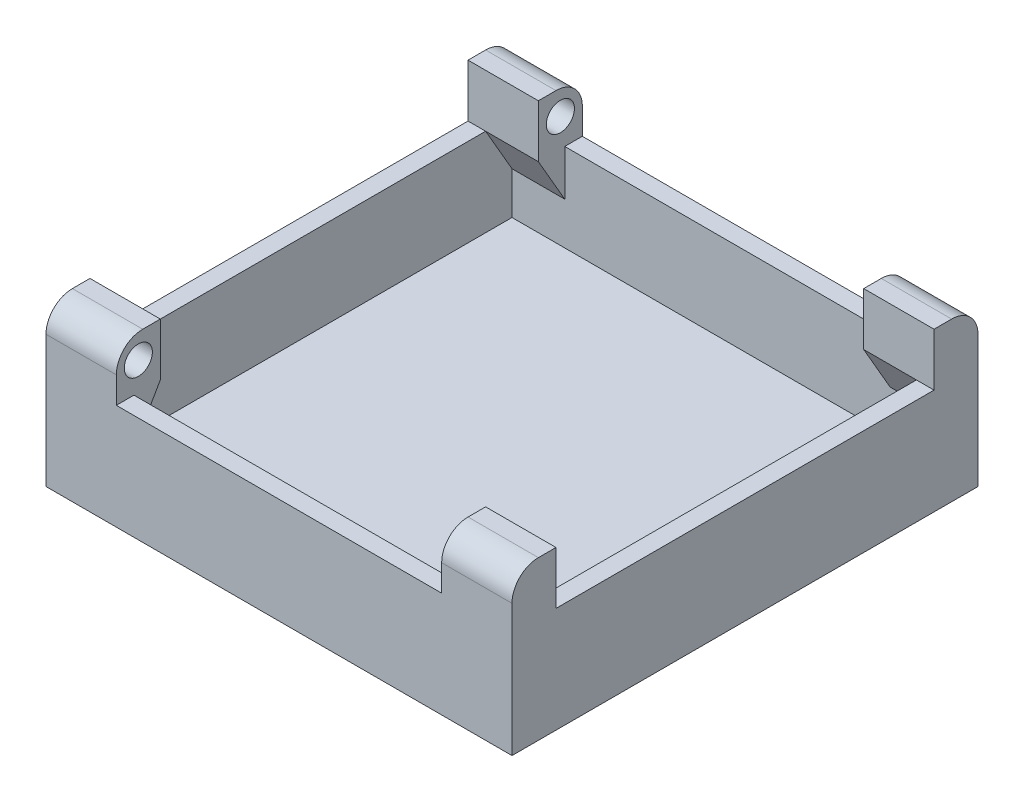
ISO-10303-21;
HEADER;
FILE_DESCRIPTION(('STEP AP214'),'2;1');
FILE_NAME('part.step','',(''),(''),'','','');
FILE_SCHEMA(('AUTOMOTIVE_DESIGN { 1 0 10303 214 1 1 1 1 }'));
ENDSEC;
DATA;
#1=APPLICATION_CONTEXT('core data for automotive mechanical design processes');
#2=APPLICATION_PROTOCOL_DEFINITION('international standard','automotive_design',2000,#1);
#3=PRODUCT_CONTEXT('',#1,'mechanical');
#4=PRODUCT('Part','Part','',(#3));
#5=PRODUCT_RELATED_PRODUCT_CATEGORY('part','',(#4));
#6=PRODUCT_DEFINITION_FORMATION('','',#4);
#7=PRODUCT_DEFINITION_CONTEXT('part definition',#1,'design');
#8=PRODUCT_DEFINITION('design','',#6,#7);
#9=PRODUCT_DEFINITION_SHAPE('','',#8);
#10=(LENGTH_UNIT() NAMED_UNIT(*) SI_UNIT(.MILLI.,.METRE.));
#11=(NAMED_UNIT(*) PLANE_ANGLE_UNIT() SI_UNIT($,.RADIAN.));
#12=(NAMED_UNIT(*) SI_UNIT($,.STERADIAN.) SOLID_ANGLE_UNIT());
#13=UNCERTAINTY_MEASURE_WITH_UNIT(LENGTH_MEASURE(1.E-05),#10,'distance_accuracy_value','');
#14=(GEOMETRIC_REPRESENTATION_CONTEXT(3) GLOBAL_UNCERTAINTY_ASSIGNED_CONTEXT((#13)) GLOBAL_UNIT_ASSIGNED_CONTEXT((#10,
#11,#12)) REPRESENTATION_CONTEXT('',''));
#15=CARTESIAN_POINT('',(0.,0.,0.));
#16=DIRECTION('',(0.,0.,1.));
#17=DIRECTION('',(1.,0.,0.));
#18=AXIS2_PLACEMENT_3D('',#15,#16,#17);
#19=CARTESIAN_POINT('',(0.,10.,0.));
#20=DIRECTION('',(0.,-1.,0.));
#21=DIRECTION('',(0.,0.,-1.));
#22=AXIS2_PLACEMENT_3D('',#19,#20,#21);
#23=PLANE('',#22);
#24=DIRECTION('',(1.,0.,0.));
#25=VECTOR('',#24,1.);
#26=CARTESIAN_POINT('',(-26.5,10.,-21.5));
#27=LINE('',#26,#25);
#28=CARTESIAN_POINT('',(-26.5,10.,-21.5));
#29=VERTEX_POINT('',#28);
#30=CARTESIAN_POINT('',(-24.5,10.,-21.5));
#31=VERTEX_POINT('',#30);
#32=EDGE_CURVE('E567',#29,#31,#27,.T.);
#33=ORIENTED_EDGE('',*,*,#32,.F.);
#34=DIRECTION('',(0.,0.,1.));
#35=VECTOR('',#34,1.);
#36=CARTESIAN_POINT('',(-26.5,10.,26.5));
#37=LINE('',#36,#35);
#38=CARTESIAN_POINT('',(-26.5,10.,21.5));
#39=VERTEX_POINT('',#38);
#40=EDGE_CURVE('E261',#29,#39,#37,.T.);
#41=ORIENTED_EDGE('',*,*,#40,.T.);
#42=DIRECTION('',(-1.,0.,0.));
#43=VECTOR('',#42,1.);
#44=CARTESIAN_POINT('',(-26.5,10.,21.5));
#45=LINE('',#44,#43);
#46=CARTESIAN_POINT('',(-24.5,10.,21.5));
#47=VERTEX_POINT('',#46);
#48=EDGE_CURVE('E323',#47,#39,#45,.T.);
#49=ORIENTED_EDGE('',*,*,#48,.F.);
#50=DIRECTION('',(0.,0.,1.));
#51=VECTOR('',#50,1.);
#52=CARTESIAN_POINT('',(-24.5,10.,24.5));
#53=LINE('',#52,#51);
#54=EDGE_CURVE('E343',#31,#47,#53,.T.);
#55=ORIENTED_EDGE('',*,*,#54,.F.);
#56=EDGE_LOOP('',(#33,#41,#49,#55));
#57=FACE_BOUND('',#56,.T.);
#58=ADVANCED_FACE('F40',(#57),#23,.F.);
#59=DIRECTION('',(0.,0.,-1.));
#60=VECTOR('',#59,1.);
#61=CARTESIAN_POINT('',(-18.5,10.,-26.5));
#62=LINE('',#61,#60);
#63=CARTESIAN_POINT('',(-18.5,10.,-24.5));
#64=VERTEX_POINT('',#63);
#65=CARTESIAN_POINT('',(-18.5,10.,-26.5));
#66=VERTEX_POINT('',#65);
#67=EDGE_CURVE('E245',#64,#66,#62,.T.);
#68=ORIENTED_EDGE('',*,*,#67,.F.);
#69=DIRECTION('',(-1.,0.,0.));
#70=VECTOR('',#69,1.);
#71=CARTESIAN_POINT('',(-24.5,10.,-24.5));
#72=LINE('',#71,#70);
#73=CARTESIAN_POINT('',(18.5,10.,-24.5));
#74=VERTEX_POINT('',#73);
#75=EDGE_CURVE('E352',#74,#64,#72,.T.);
#76=ORIENTED_EDGE('',*,*,#75,.F.);
#77=DIRECTION('',(0.,0.,1.));
#78=VECTOR('',#77,1.);
#79=CARTESIAN_POINT('',(18.5,10.,-26.5));
#80=LINE('',#79,#78);
#81=CARTESIAN_POINT('',(18.5,10.,-26.5));
#82=VERTEX_POINT('',#81);
#83=EDGE_CURVE('E262',#82,#74,#80,.T.);
#84=ORIENTED_EDGE('',*,*,#83,.F.);
#85=DIRECTION('',(-1.,0.,0.));
#86=VECTOR('',#85,1.);
#87=CARTESIAN_POINT('',(-26.5,10.,-26.5));
#88=LINE('',#87,#86);
#89=EDGE_CURVE('E376',#82,#66,#88,.T.);
#90=ORIENTED_EDGE('',*,*,#89,.T.);
#91=EDGE_LOOP('',(#68,#76,#84,#90));
#92=FACE_BOUND('',#91,.T.);
#93=ADVANCED_FACE('F494',(#92),#23,.F.);
#94=DIRECTION('',(1.,0.,0.));
#95=VECTOR('',#94,1.);
#96=CARTESIAN_POINT('',(26.5,10.,-21.5));
#97=LINE('',#96,#95);
#98=CARTESIAN_POINT('',(24.5,10.,-21.5));
#99=VERTEX_POINT('',#98);
#100=CARTESIAN_POINT('',(26.5,10.,-21.5));
#101=VERTEX_POINT('',#100);
#102=EDGE_CURVE('E265',#99,#101,#97,.T.);
#103=ORIENTED_EDGE('',*,*,#102,.F.);
#104=DIRECTION('',(0.,0.,-1.));
#105=VECTOR('',#104,1.);
#106=CARTESIAN_POINT('',(24.5,10.,24.5));
#107=LINE('',#106,#105);
#108=CARTESIAN_POINT('',(24.5,10.,21.5));
#109=VERTEX_POINT('',#108);
#110=EDGE_CURVE('E349',#109,#99,#107,.T.);
#111=ORIENTED_EDGE('',*,*,#110,.F.);
#112=DIRECTION('',(-1.,0.,0.));
#113=VECTOR('',#112,1.);
#114=CARTESIAN_POINT('',(26.5,10.,21.5));
#115=LINE('',#114,#113);
#116=CARTESIAN_POINT('',(26.5,10.,21.5));
#117=VERTEX_POINT('',#116);
#118=EDGE_CURVE('E298',#117,#109,#115,.T.);
#119=ORIENTED_EDGE('',*,*,#118,.F.);
#120=DIRECTION('',(0.,0.,-1.));
#121=VECTOR('',#120,1.);
#122=CARTESIAN_POINT('',(26.5,10.,26.5));
#123=LINE('',#122,#121);
#124=EDGE_CURVE('E373',#117,#101,#123,.T.);
#125=ORIENTED_EDGE('',*,*,#124,.T.);
#126=EDGE_LOOP('',(#103,#111,#119,#125));
#127=FACE_BOUND('',#126,.T.);
#128=ADVANCED_FACE('F507',(#127),#23,.F.);
#129=DIRECTION('',(0.,0.,1.));
#130=VECTOR('',#129,1.);
#131=CARTESIAN_POINT('',(18.5,10.,26.5));
#132=LINE('',#131,#130);
#133=CARTESIAN_POINT('',(18.5,10.,24.5));
#134=VERTEX_POINT('',#133);
#135=CARTESIAN_POINT('',(18.5,10.,26.5));
#136=VERTEX_POINT('',#135);
#137=EDGE_CURVE('E292',#134,#136,#132,.T.);
#138=ORIENTED_EDGE('',*,*,#137,.F.);
#139=DIRECTION('',(1.,0.,0.));
#140=VECTOR('',#139,1.);
#141=CARTESIAN_POINT('',(-24.5,10.,24.5));
#142=LINE('',#141,#140);
#143=CARTESIAN_POINT('',(-18.5,10.,24.5));
#144=VERTEX_POINT('',#143);
#145=EDGE_CURVE('E345',#144,#134,#142,.T.);
#146=ORIENTED_EDGE('',*,*,#145,.F.);
#147=DIRECTION('',(0.,0.,-1.));
#148=VECTOR('',#147,1.);
#149=CARTESIAN_POINT('',(-18.5,10.,26.5));
#150=LINE('',#149,#148);
#151=CARTESIAN_POINT('',(-18.5,10.,26.5));
#152=VERTEX_POINT('',#151);
#153=EDGE_CURVE('E309',#152,#144,#150,.T.);
#154=ORIENTED_EDGE('',*,*,#153,.F.);
#155=DIRECTION('',(1.,0.,0.));
#156=VECTOR('',#155,1.);
#157=CARTESIAN_POINT('',(-26.5,10.,26.5));
#158=LINE('',#157,#156);
#159=EDGE_CURVE('E380',#152,#136,#158,.T.);
#160=ORIENTED_EDGE('',*,*,#159,.T.);
#161=EDGE_LOOP('',(#138,#146,#154,#160));
#162=FACE_BOUND('',#161,.T.);
#163=ADVANCED_FACE('F542',(#162),#23,.F.);
#164=CARTESIAN_POINT('',(26.5,10.,26.5));
#165=DIRECTION('',(-1.,0.,0.));
#166=DIRECTION('',(0.,0.,1.));
#167=AXIS2_PLACEMENT_3D('',#164,#165,#166);
#168=PLANE('',#167);
#169=DIRECTION('',(0.,0.,-1.));
#170=VECTOR('',#169,1.);
#171=CARTESIAN_POINT('',(26.5,16.,26.5));
#172=LINE('',#171,#170);
#173=CARTESIAN_POINT('',(26.5,16.,23.5));
#174=VERTEX_POINT('',#173);
#175=CARTESIAN_POINT('',(26.5,16.,21.5));
#176=VERTEX_POINT('',#175);
#177=EDGE_CURVE('E289',#174,#176,#172,.T.);
#178=ORIENTED_EDGE('',*,*,#177,.F.);
#179=CARTESIAN_POINT('',(26.5,13.,23.5));
#180=DIRECTION('',(-1.,0.,0.));
#181=DIRECTION('',(0.,0.,1.));
#182=AXIS2_PLACEMENT_3D('',#179,#180,#181);
#183=CIRCLE('',#182,3.);
#184=CARTESIAN_POINT('',(26.5,13.,26.5));
#185=VERTEX_POINT('',#184);
#186=EDGE_CURVE('E443',#174,#185,#183,.F.);
#187=ORIENTED_EDGE('',*,*,#186,.T.);
#188=DIRECTION('',(0.,-1.,0.));
#189=VECTOR('',#188,1.);
#190=CARTESIAN_POINT('',(26.5,10.,26.5));
#191=LINE('',#190,#189);
#192=CARTESIAN_POINT('',(26.5,-2.,26.5));
#193=VERTEX_POINT('',#192);
#194=EDGE_CURVE('E383',#185,#193,#191,.T.);
#195=ORIENTED_EDGE('',*,*,#194,.T.);
#196=DIRECTION('',(0.,0.,1.));
#197=VECTOR('',#196,1.);
#198=CARTESIAN_POINT('',(26.5,-2.,-26.5));
#199=LINE('',#198,#197);
#200=CARTESIAN_POINT('',(26.5,-2.,-26.5));
#201=VERTEX_POINT('',#200);
#202=EDGE_CURVE('E336',#201,#193,#199,.T.);
#203=ORIENTED_EDGE('',*,*,#202,.F.);
#204=DIRECTION('',(0.,-1.,0.));
#205=VECTOR('',#204,1.);
#206=CARTESIAN_POINT('',(26.5,10.,-26.5));
#207=LINE('',#206,#205);
#208=CARTESIAN_POINT('',(26.5,13.,-26.5));
#209=VERTEX_POINT('',#208);
#210=EDGE_CURVE('E389',#209,#201,#207,.T.);
#211=ORIENTED_EDGE('',*,*,#210,.F.);
#212=CARTESIAN_POINT('',(26.5,13.,-23.5));
#213=DIRECTION('',(-1.,0.,0.));
#214=DIRECTION('',(0.,0.,1.));
#215=AXIS2_PLACEMENT_3D('',#212,#213,#214);
#216=CIRCLE('',#215,3.);
#217=CARTESIAN_POINT('',(26.5,16.,-23.5));
#218=VERTEX_POINT('',#217);
#219=EDGE_CURVE('E441',#209,#218,#216,.F.);
#220=ORIENTED_EDGE('',*,*,#219,.T.);
#221=DIRECTION('',(0.,0.,-1.));
#222=VECTOR('',#221,1.);
#223=CARTESIAN_POINT('',(26.5,16.,-26.5));
#224=LINE('',#223,#222);
#225=CARTESIAN_POINT('',(26.5,16.,-21.5));
#226=VERTEX_POINT('',#225);
#227=EDGE_CURVE('E276',#226,#218,#224,.T.);
#228=ORIENTED_EDGE('',*,*,#227,.F.);
#229=DIRECTION('',(0.,-1.,0.));
#230=VECTOR('',#229,1.);
#231=CARTESIAN_POINT('',(26.5,16.,-21.5));
#232=LINE('',#231,#230);
#233=EDGE_CURVE('E278',#226,#101,#232,.T.);
#234=ORIENTED_EDGE('',*,*,#233,.T.);
#235=ORIENTED_EDGE('',*,*,#124,.F.);
#236=DIRECTION('',(0.,-1.,0.));
#237=VECTOR('',#236,1.);
#238=CARTESIAN_POINT('',(26.5,16.,21.5));
#239=LINE('',#238,#237);
#240=EDGE_CURVE('E307',#176,#117,#239,.T.);
#241=ORIENTED_EDGE('',*,*,#240,.F.);
#242=EDGE_LOOP('',(#178,#187,#195,#203,#211,#220,#228,#234,#235,#241));
#243=FACE_BOUND('',#242,.T.);
#244=ADVANCED_FACE('F482',(#243),#168,.F.);
#245=CARTESIAN_POINT('',(-26.5,10.,-26.5));
#246=DIRECTION('',(0.,0.,1.));
#247=DIRECTION('',(1.,0.,0.));
#248=AXIS2_PLACEMENT_3D('',#245,#246,#247);
#249=PLANE('',#248);
#250=DIRECTION('',(0.,-1.,0.));
#251=VECTOR('',#250,1.);
#252=CARTESIAN_POINT('',(-26.5,10.,-26.5));
#253=LINE('',#252,#251);
#254=CARTESIAN_POINT('',(-26.5,13.,-26.5));
#255=VERTEX_POINT('',#254);
#256=CARTESIAN_POINT('',(-26.5,-2.,-26.5));
#257=VERTEX_POINT('',#256);
#258=EDGE_CURVE('E387',#255,#257,#253,.T.);
#259=ORIENTED_EDGE('',*,*,#258,.F.);
#260=DIRECTION('',(-1.,0.,0.));
#261=VECTOR('',#260,1.);
#262=CARTESIAN_POINT('',(-18.5,13.,-26.5));
#263=LINE('',#262,#261);
#264=CARTESIAN_POINT('',(-18.5,13.,-26.5));
#265=VERTEX_POINT('',#264);
#266=EDGE_CURVE('E463',#255,#265,#263,.F.);
#267=ORIENTED_EDGE('',*,*,#266,.T.);
#268=DIRECTION('',(0.,-1.,0.));
#269=VECTOR('',#268,1.);
#270=CARTESIAN_POINT('',(-18.5,16.,-26.5));
#271=LINE('',#270,#269);
#272=EDGE_CURVE('E267',#265,#66,#271,.T.);
#273=ORIENTED_EDGE('',*,*,#272,.T.);
#274=ORIENTED_EDGE('',*,*,#89,.F.);
#275=DIRECTION('',(0.,-1.,0.));
#276=VECTOR('',#275,1.);
#277=CARTESIAN_POINT('',(18.5,16.,-26.5));
#278=LINE('',#277,#276);
#279=CARTESIAN_POINT('',(18.5,13.,-26.5));
#280=VERTEX_POINT('',#279);
#281=EDGE_CURVE('E286',#280,#82,#278,.T.);
#282=ORIENTED_EDGE('',*,*,#281,.F.);
#283=DIRECTION('',(-1.,0.,0.));
#284=VECTOR('',#283,1.);
#285=CARTESIAN_POINT('',(26.5,13.,-26.5));
#286=LINE('',#285,#284);
#287=EDGE_CURVE('E461',#280,#209,#286,.F.);
#288=ORIENTED_EDGE('',*,*,#287,.T.);
#289=ORIENTED_EDGE('',*,*,#210,.T.);
#290=DIRECTION('',(1.,0.,0.));
#291=VECTOR('',#290,1.);
#292=CARTESIAN_POINT('',(-26.5,-2.,-26.5));
#293=LINE('',#292,#291);
#294=EDGE_CURVE('E333',#257,#201,#293,.T.);
#295=ORIENTED_EDGE('',*,*,#294,.F.);
#296=EDGE_LOOP('',(#259,#267,#273,#274,#282,#288,#289,#295));
#297=FACE_BOUND('',#296,.T.);
#298=ADVANCED_FACE('F487',(#297),#249,.F.);
#299=CARTESIAN_POINT('',(-26.5,10.,26.5));
#300=DIRECTION('',(1.,0.,0.));
#301=DIRECTION('',(0.,0.,-1.));
#302=AXIS2_PLACEMENT_3D('',#299,#300,#301);
#303=PLANE('',#302);
#304=DIRECTION('',(0.,-1.,0.));
#305=VECTOR('',#304,1.);
#306=CARTESIAN_POINT('',(-26.5,10.,26.5));
#307=LINE('',#306,#305);
#308=CARTESIAN_POINT('',(-26.5,13.,26.5));
#309=VERTEX_POINT('',#308);
#310=CARTESIAN_POINT('',(-26.5,-2.,26.5));
#311=VERTEX_POINT('',#310);
#312=EDGE_CURVE('E385',#309,#311,#307,.T.);
#313=ORIENTED_EDGE('',*,*,#312,.F.);
#314=CARTESIAN_POINT('',(-26.5,13.,23.5));
#315=DIRECTION('',(1.,0.,0.));
#316=DIRECTION('',(0.,0.,-1.));
#317=AXIS2_PLACEMENT_3D('',#314,#315,#316);
#318=CIRCLE('',#317,3.);
#319=CARTESIAN_POINT('',(-26.5,16.,23.5));
#320=VERTEX_POINT('',#319);
#321=EDGE_CURVE('E458',#309,#320,#318,.F.);
#322=ORIENTED_EDGE('',*,*,#321,.T.);
#323=DIRECTION('',(0.,0.,1.));
#324=VECTOR('',#323,1.);
#325=CARTESIAN_POINT('',(-26.5,16.,26.5));
#326=LINE('',#325,#324);
#327=CARTESIAN_POINT('',(-26.5,16.,21.5));
#328=VERTEX_POINT('',#327);
#329=EDGE_CURVE('E310',#328,#320,#326,.T.);
#330=ORIENTED_EDGE('',*,*,#329,.F.);
#331=DIRECTION('',(0.,-1.,0.));
#332=VECTOR('',#331,1.);
#333=CARTESIAN_POINT('',(-26.5,16.,21.5));
#334=LINE('',#333,#332);
#335=EDGE_CURVE('E318',#328,#39,#334,.T.);
#336=ORIENTED_EDGE('',*,*,#335,.T.);
#337=ORIENTED_EDGE('',*,*,#40,.F.);
#338=DIRECTION('',(0.,-1.,0.));
#339=VECTOR('',#338,1.);
#340=CARTESIAN_POINT('',(-26.5,16.,-21.5));
#341=LINE('',#340,#339);
#342=CARTESIAN_POINT('',(-26.5,16.,-21.5));
#343=VERTEX_POINT('',#342);
#344=EDGE_CURVE('E250',#343,#29,#341,.T.);
#345=ORIENTED_EDGE('',*,*,#344,.F.);
#346=DIRECTION('',(0.,0.,1.));
#347=VECTOR('',#346,1.);
#348=CARTESIAN_POINT('',(-26.5,16.,-26.5));
#349=LINE('',#348,#347);
#350=CARTESIAN_POINT('',(-26.5,16.,-23.5));
#351=VERTEX_POINT('',#350);
#352=EDGE_CURVE('E235',#351,#343,#349,.T.);
#353=ORIENTED_EDGE('',*,*,#352,.F.);
#354=CARTESIAN_POINT('',(-26.5,13.,-23.5));
#355=DIRECTION('',(1.,0.,0.));
#356=DIRECTION('',(0.,0.,-1.));
#357=AXIS2_PLACEMENT_3D('',#354,#355,#356);
#358=CIRCLE('',#357,3.);
#359=EDGE_CURVE('E456',#351,#255,#358,.F.);
#360=ORIENTED_EDGE('',*,*,#359,.T.);
#361=ORIENTED_EDGE('',*,*,#258,.T.);
#362=DIRECTION('',(0.,0.,-1.));
#363=VECTOR('',#362,1.);
#364=CARTESIAN_POINT('',(-26.5,-2.,-26.5));
#365=LINE('',#364,#363);
#366=EDGE_CURVE('E330',#311,#257,#365,.T.);
#367=ORIENTED_EDGE('',*,*,#366,.F.);
#368=EDGE_LOOP('',(#313,#322,#330,#336,#337,#345,#353,#360,#361,#367));
#369=FACE_BOUND('',#368,.T.);
#370=ADVANCED_FACE('F259',(#369),#303,.F.);
#371=CARTESIAN_POINT('',(-26.5,10.,26.5));
#372=DIRECTION('',(0.,0.,-1.));
#373=DIRECTION('',(-1.,0.,0.));
#374=AXIS2_PLACEMENT_3D('',#371,#372,#373);
#375=PLANE('',#374);
#376=ORIENTED_EDGE('',*,*,#194,.F.);
#377=DIRECTION('',(1.,0.,0.));
#378=VECTOR('',#377,1.);
#379=CARTESIAN_POINT('',(18.5,13.,26.5));
#380=LINE('',#379,#378);
#381=CARTESIAN_POINT('',(18.5,13.,26.5));
#382=VERTEX_POINT('',#381);
#383=EDGE_CURVE('E447',#185,#382,#380,.F.);
#384=ORIENTED_EDGE('',*,*,#383,.T.);
#385=DIRECTION('',(0.,-1.,0.));
#386=VECTOR('',#385,1.);
#387=CARTESIAN_POINT('',(18.5,16.,26.5));
#388=LINE('',#387,#386);
#389=EDGE_CURVE('E297',#382,#136,#388,.T.);
#390=ORIENTED_EDGE('',*,*,#389,.T.);
#391=ORIENTED_EDGE('',*,*,#159,.F.);
#392=DIRECTION('',(0.,-1.,0.));
#393=VECTOR('',#392,1.);
#394=CARTESIAN_POINT('',(-18.5,16.,26.5));
#395=LINE('',#394,#393);
#396=CARTESIAN_POINT('',(-18.5,13.,26.5));
#397=VERTEX_POINT('',#396);
#398=EDGE_CURVE('E328',#397,#152,#395,.T.);
#399=ORIENTED_EDGE('',*,*,#398,.F.);
#400=DIRECTION('',(1.,0.,0.));
#401=VECTOR('',#400,1.);
#402=CARTESIAN_POINT('',(-26.5,13.,26.5));
#403=LINE('',#402,#401);
#404=EDGE_CURVE('E445',#397,#309,#403,.F.);
#405=ORIENTED_EDGE('',*,*,#404,.T.);
#406=ORIENTED_EDGE('',*,*,#312,.T.);
#407=DIRECTION('',(-1.,0.,0.));
#408=VECTOR('',#407,1.);
#409=CARTESIAN_POINT('',(-26.5,-2.,26.5));
#410=LINE('',#409,#408);
#411=EDGE_CURVE('E339',#193,#311,#410,.T.);
#412=ORIENTED_EDGE('',*,*,#411,.F.);
#413=EDGE_LOOP('',(#376,#384,#390,#391,#399,#405,#406,#412));
#414=FACE_BOUND('',#413,.T.);
#415=ADVANCED_FACE('F535',(#414),#375,.F.);
#416=CARTESIAN_POINT('',(-24.5,10.,24.5));
#417=DIRECTION('',(1.,0.,0.));
#418=DIRECTION('',(0.,0.,-1.));
#419=AXIS2_PLACEMENT_3D('',#416,#417,#418);
#420=PLANE('',#419);
#421=ORIENTED_EDGE('',*,*,#54,.T.);
#422=DIRECTION('',(0.,0.866025403784442,-0.499999999999995));
#423=VECTOR('',#422,1.);
#424=CARTESIAN_POINT('',(-24.5,8.70096189432335,22.25));
#425=LINE('',#424,#423);
#426=CARTESIAN_POINT('',(-24.5,4.8038475772933,24.5));
#427=VERTEX_POINT('',#426);
#428=EDGE_CURVE('E404',#47,#427,#425,.F.);
#429=ORIENTED_EDGE('',*,*,#428,.T.);
#430=DIRECTION('',(0.,-1.,0.));
#431=VECTOR('',#430,1.);
#432=CARTESIAN_POINT('',(-24.5,10.,24.5));
#433=LINE('',#432,#431);
#434=CARTESIAN_POINT('',(-24.5,0.,24.5));
#435=VERTEX_POINT('',#434);
#436=EDGE_CURVE('E371',#427,#435,#433,.T.);
#437=ORIENTED_EDGE('',*,*,#436,.T.);
#438=DIRECTION('',(0.,0.,1.));
#439=VECTOR('',#438,1.);
#440=CARTESIAN_POINT('',(-24.5,0.,24.5));
#441=LINE('',#440,#439);
#442=CARTESIAN_POINT('',(-24.5,0.,-24.5));
#443=VERTEX_POINT('',#442);
#444=EDGE_CURVE('E342',#443,#435,#441,.T.);
#445=ORIENTED_EDGE('',*,*,#444,.F.);
#446=DIRECTION('',(0.,-1.,0.));
#447=VECTOR('',#446,1.);
#448=CARTESIAN_POINT('',(-24.5,10.,-24.5));
#449=LINE('',#448,#447);
#450=CARTESIAN_POINT('',(-24.5,4.8038475772933,-24.5));
#451=VERTEX_POINT('',#450);
#452=EDGE_CURVE('E355',#451,#443,#449,.T.);
#453=ORIENTED_EDGE('',*,*,#452,.F.);
#454=DIRECTION('',(0.,0.866025403784442,0.499999999999994));
#455=VECTOR('',#454,1.);
#456=CARTESIAN_POINT('',(-24.5,29.9185842870419,-10.0000000000003));
#457=LINE('',#456,#455);
#458=EDGE_CURVE('E402',#451,#31,#457,.T.);
#459=ORIENTED_EDGE('',*,*,#458,.T.);
#460=EDGE_LOOP('',(#421,#429,#437,#445,#453,#459));
#461=FACE_BOUND('',#460,.T.);
#462=ADVANCED_FACE('F677',(#461),#420,.T.);
#463=CARTESIAN_POINT('',(-24.5,10.,24.5));
#464=DIRECTION('',(0.,0.,-1.));
#465=DIRECTION('',(-1.,0.,0.));
#466=AXIS2_PLACEMENT_3D('',#463,#464,#465);
#467=PLANE('',#466);
#468=ORIENTED_EDGE('',*,*,#436,.F.);
#469=DIRECTION('',(1.,0.,0.));
#470=VECTOR('',#469,1.);
#471=CARTESIAN_POINT('',(-18.5,4.8038475772933,24.5));
#472=LINE('',#471,#470);
#473=CARTESIAN_POINT('',(-18.5,4.8038475772933,24.5));
#474=VERTEX_POINT('',#473);
#475=EDGE_CURVE('E399',#427,#474,#472,.T.);
#476=ORIENTED_EDGE('',*,*,#475,.T.);
#477=DIRECTION('',(0.,1.,0.));
#478=VECTOR('',#477,1.);
#479=CARTESIAN_POINT('',(-18.5,10.,24.5));
#480=LINE('',#479,#478);
#481=EDGE_CURVE('E397',#474,#144,#480,.T.);
#482=ORIENTED_EDGE('',*,*,#481,.T.);
#483=ORIENTED_EDGE('',*,*,#145,.T.);
#484=DIRECTION('',(0.,-1.,0.));
#485=VECTOR('',#484,1.);
#486=CARTESIAN_POINT('',(18.5,10.,24.5));
#487=LINE('',#486,#485);
#488=CARTESIAN_POINT('',(18.5,4.8038475772933,24.5));
#489=VERTEX_POINT('',#488);
#490=EDGE_CURVE('E391',#134,#489,#487,.T.);
#491=ORIENTED_EDGE('',*,*,#490,.T.);
#492=DIRECTION('',(1.,0.,0.));
#493=VECTOR('',#492,1.);
#494=CARTESIAN_POINT('',(-24.5,4.8038475772933,24.5));
#495=LINE('',#494,#493);
#496=CARTESIAN_POINT('',(24.5,4.8038475772933,24.5));
#497=VERTEX_POINT('',#496);
#498=EDGE_CURVE('E394',#489,#497,#495,.T.);
#499=ORIENTED_EDGE('',*,*,#498,.T.);
#500=DIRECTION('',(0.,-1.,0.));
#501=VECTOR('',#500,1.);
#502=CARTESIAN_POINT('',(24.5,10.,24.5));
#503=LINE('',#502,#501);
#504=CARTESIAN_POINT('',(24.5,0.,24.5));
#505=VERTEX_POINT('',#504);
#506=EDGE_CURVE('E369',#497,#505,#503,.T.);
#507=ORIENTED_EDGE('',*,*,#506,.T.);
#508=DIRECTION('',(1.,0.,0.));
#509=VECTOR('',#508,1.);
#510=CARTESIAN_POINT('',(-24.5,0.,24.5));
#511=LINE('',#510,#509);
#512=EDGE_CURVE('E358',#435,#505,#511,.T.);
#513=ORIENTED_EDGE('',*,*,#512,.F.);
#514=EDGE_LOOP('',(#468,#476,#482,#483,#491,#499,#507,#513));
#515=FACE_BOUND('',#514,.T.);
#516=ADVANCED_FACE('F965',(#515),#467,.T.);
#517=CARTESIAN_POINT('',(24.5,10.,24.5));
#518=DIRECTION('',(-1.,0.,0.));
#519=DIRECTION('',(0.,0.,1.));
#520=AXIS2_PLACEMENT_3D('',#517,#518,#519);
#521=PLANE('',#520);
#522=ORIENTED_EDGE('',*,*,#506,.F.);
#523=DIRECTION('',(0.,0.866025403784442,-0.499999999999995));
#524=VECTOR('',#523,1.);
#525=CARTESIAN_POINT('',(24.5,8.70096189432335,22.25));
#526=LINE('',#525,#524);
#527=EDGE_CURVE('E408',#497,#109,#526,.T.);
#528=ORIENTED_EDGE('',*,*,#527,.T.);
#529=ORIENTED_EDGE('',*,*,#110,.T.);
#530=DIRECTION('',(0.,-0.866025403784442,-0.499999999999995));
#531=VECTOR('',#530,1.);
#532=CARTESIAN_POINT('',(24.5,29.918584287042,-10.0000000000003));
#533=LINE('',#532,#531);
#534=CARTESIAN_POINT('',(24.5,4.80384757729332,-24.5));
#535=VERTEX_POINT('',#534);
#536=EDGE_CURVE('E406',#99,#535,#533,.T.);
#537=ORIENTED_EDGE('',*,*,#536,.T.);
#538=DIRECTION('',(0.,-1.,0.));
#539=VECTOR('',#538,1.);
#540=CARTESIAN_POINT('',(24.5,10.,-24.5));
#541=LINE('',#540,#539);
#542=CARTESIAN_POINT('',(24.5,0.,-24.5));
#543=VERTEX_POINT('',#542);
#544=EDGE_CURVE('E367',#535,#543,#541,.T.);
#545=ORIENTED_EDGE('',*,*,#544,.T.);
#546=DIRECTION('',(0.,0.,-1.));
#547=VECTOR('',#546,1.);
#548=CARTESIAN_POINT('',(24.5,0.,24.5));
#549=LINE('',#548,#547);
#550=EDGE_CURVE('E361',#505,#543,#549,.T.);
#551=ORIENTED_EDGE('',*,*,#550,.F.);
#552=EDGE_LOOP('',(#522,#528,#529,#537,#545,#551));
#553=FACE_BOUND('',#552,.T.);
#554=ADVANCED_FACE('F512',(#553),#521,.T.);
#555=CARTESIAN_POINT('',(-24.5,10.,-24.5));
#556=DIRECTION('',(0.,0.,1.));
#557=DIRECTION('',(1.,0.,0.));
#558=AXIS2_PLACEMENT_3D('',#555,#556,#557);
#559=PLANE('',#558);
#560=ORIENTED_EDGE('',*,*,#544,.F.);
#561=DIRECTION('',(-1.,0.,0.));
#562=VECTOR('',#561,1.);
#563=CARTESIAN_POINT('',(-24.5,4.80384757729332,-24.5));
#564=LINE('',#563,#562);
#565=CARTESIAN_POINT('',(18.5,4.80384757729332,-24.5));
#566=VERTEX_POINT('',#565);
#567=EDGE_CURVE('E418',#535,#566,#564,.T.);
#568=ORIENTED_EDGE('',*,*,#567,.T.);
#569=DIRECTION('',(0.,1.,0.));
#570=VECTOR('',#569,1.);
#571=CARTESIAN_POINT('',(18.5,10.,-24.5));
#572=LINE('',#571,#570);
#573=EDGE_CURVE('E416',#566,#74,#572,.T.);
#574=ORIENTED_EDGE('',*,*,#573,.T.);
#575=ORIENTED_EDGE('',*,*,#75,.T.);
#576=DIRECTION('',(0.,-1.,0.));
#577=VECTOR('',#576,1.);
#578=CARTESIAN_POINT('',(-18.5,10.,-24.5));
#579=LINE('',#578,#577);
#580=CARTESIAN_POINT('',(-18.5,4.8038475772933,-24.5));
#581=VERTEX_POINT('',#580);
#582=EDGE_CURVE('E410',#64,#581,#579,.T.);
#583=ORIENTED_EDGE('',*,*,#582,.T.);
#584=DIRECTION('',(-1.,0.,0.));
#585=VECTOR('',#584,1.);
#586=CARTESIAN_POINT('',(-24.5,4.8038475772933,-24.5));
#587=LINE('',#586,#585);
#588=EDGE_CURVE('E413',#581,#451,#587,.T.);
#589=ORIENTED_EDGE('',*,*,#588,.T.);
#590=ORIENTED_EDGE('',*,*,#452,.T.);
#591=DIRECTION('',(-1.,0.,0.));
#592=VECTOR('',#591,1.);
#593=CARTESIAN_POINT('',(-24.5,0.,-24.5));
#594=LINE('',#593,#592);
#595=EDGE_CURVE('E346',#543,#443,#594,.T.);
#596=ORIENTED_EDGE('',*,*,#595,.F.);
#597=EDGE_LOOP('',(#560,#568,#574,#575,#583,#589,#590,#596));
#598=FACE_BOUND('',#597,.T.);
#599=ADVANCED_FACE('F498',(#598),#559,.T.);
#600=CARTESIAN_POINT('',(0.,0.,0.));
#601=DIRECTION('',(0.,1.,0.));
#602=DIRECTION('',(0.,0.,1.));
#603=AXIS2_PLACEMENT_3D('',#600,#601,#602);
#604=PLANE('',#603);
#605=ORIENTED_EDGE('',*,*,#550,.T.);
#606=ORIENTED_EDGE('',*,*,#595,.T.);
#607=ORIENTED_EDGE('',*,*,#444,.T.);
#608=ORIENTED_EDGE('',*,*,#512,.T.);
#609=EDGE_LOOP('',(#605,#606,#607,#608));
#610=FACE_BOUND('',#609,.T.);
#611=ADVANCED_FACE('F582',(#610),#604,.T.);
#612=CARTESIAN_POINT('',(0.,-2.,0.));
#613=DIRECTION('',(0.,1.,0.));
#614=DIRECTION('',(0.,0.,1.));
#615=AXIS2_PLACEMENT_3D('',#612,#613,#614);
#616=PLANE('',#615);
#617=ORIENTED_EDGE('',*,*,#366,.T.);
#618=ORIENTED_EDGE('',*,*,#294,.T.);
#619=ORIENTED_EDGE('',*,*,#202,.T.);
#620=ORIENTED_EDGE('',*,*,#411,.T.);
#621=EDGE_LOOP('',(#617,#618,#619,#620));
#622=FACE_BOUND('',#621,.T.);
#623=ADVANCED_FACE('F579',(#622),#616,.F.);
#624=CARTESIAN_POINT('',(-18.5,16.,26.5));
#625=DIRECTION('',(-1.,0.,0.));
#626=DIRECTION('',(0.,0.,1.));
#627=AXIS2_PLACEMENT_3D('',#624,#625,#626);
#628=PLANE('',#627);
#629=CARTESIAN_POINT('',(-18.5,13.2,24.));
#630=DIRECTION('',(-1.,0.,0.));
#631=DIRECTION('',(0.,0.,1.));
#632=AXIS2_PLACEMENT_3D('',#629,#630,#631);
#633=CIRCLE('',#632,1.6);
#634=CARTESIAN_POINT('',(-18.5,13.2,25.6));
#635=VERTEX_POINT('',#634);
#636=EDGE_CURVE('E438',#635,#635,#633,.F.);
#637=ORIENTED_EDGE('',*,*,#636,.F.);
#638=EDGE_LOOP('',(#637));
#639=FACE_BOUND('',#638,.T.);
#640=DIRECTION('',(0.,0.,-1.));
#641=VECTOR('',#640,1.);
#642=CARTESIAN_POINT('',(-18.5,16.,26.5));
#643=LINE('',#642,#641);
#644=CARTESIAN_POINT('',(-18.5,16.,23.5));
#645=VERTEX_POINT('',#644);
#646=CARTESIAN_POINT('',(-18.5,16.,21.5));
#647=VERTEX_POINT('',#646);
#648=EDGE_CURVE('E313',#645,#647,#643,.T.);
#649=ORIENTED_EDGE('',*,*,#648,.F.);
#650=CARTESIAN_POINT('',(-18.5,13.,23.5));
#651=DIRECTION('',(-1.,0.,0.));
#652=DIRECTION('',(0.,0.,1.));
#653=AXIS2_PLACEMENT_3D('',#650,#651,#652);
#654=CIRCLE('',#653,3.);
#655=EDGE_CURVE('E454',#645,#397,#654,.F.);
#656=ORIENTED_EDGE('',*,*,#655,.T.);
#657=ORIENTED_EDGE('',*,*,#398,.T.);
#658=ORIENTED_EDGE('',*,*,#153,.T.);
#659=ORIENTED_EDGE('',*,*,#481,.F.);
#660=DIRECTION('',(0.,-0.866025403784442,0.499999999999995));
#661=VECTOR('',#660,1.);
#662=CARTESIAN_POINT('',(-18.5,12.334936490539,20.1519237886467));
#663=LINE('',#662,#661);
#664=CARTESIAN_POINT('',(-18.5,10.,21.5));
#665=VERTEX_POINT('',#664);
#666=EDGE_CURVE('E421',#474,#665,#663,.F.);
#667=ORIENTED_EDGE('',*,*,#666,.T.);
#668=DIRECTION('',(0.,-1.,0.));
#669=VECTOR('',#668,1.);
#670=CARTESIAN_POINT('',(-18.5,16.,21.5));
#671=LINE('',#670,#669);
#672=EDGE_CURVE('E325',#647,#665,#671,.T.);
#673=ORIENTED_EDGE('',*,*,#672,.F.);
#674=EDGE_LOOP('',(#649,#656,#657,#658,#659,#667,#673));
#675=FACE_BOUND('',#674,.T.);
#676=ADVANCED_FACE('F581',(#639,#675),#628,.F.);
#677=CARTESIAN_POINT('',(-26.5,16.,21.5));
#678=DIRECTION('',(0.,0.,1.));
#679=DIRECTION('',(1.,0.,0.));
#680=AXIS2_PLACEMENT_3D('',#677,#678,#679);
#681=PLANE('',#680);
#682=EDGE_CURVE('E314',#665,#47,#45,.T.);
#683=ORIENTED_EDGE('',*,*,#682,.T.);
#684=ORIENTED_EDGE('',*,*,#48,.T.);
#685=ORIENTED_EDGE('',*,*,#335,.F.);
#686=DIRECTION('',(-1.,0.,0.));
#687=VECTOR('',#686,1.);
#688=CARTESIAN_POINT('',(-26.5,16.,21.5));
#689=LINE('',#688,#687);
#690=EDGE_CURVE('E316',#647,#328,#689,.T.);
#691=ORIENTED_EDGE('',*,*,#690,.F.);
#692=ORIENTED_EDGE('',*,*,#672,.T.);
#693=EDGE_LOOP('',(#683,#684,#685,#691,#692));
#694=FACE_BOUND('',#693,.T.);
#695=ADVANCED_FACE('F560',(#694),#681,.F.);
#696=CARTESIAN_POINT('',(0.,16.,0.));
#697=DIRECTION('',(0.,-1.,0.));
#698=DIRECTION('',(0.,0.,-1.));
#699=AXIS2_PLACEMENT_3D('',#696,#697,#698);
#700=PLANE('',#699);
#701=ORIENTED_EDGE('',*,*,#329,.T.);
#702=DIRECTION('',(1.,0.,0.));
#703=VECTOR('',#702,1.);
#704=CARTESIAN_POINT('',(0.,16.,23.5));
#705=LINE('',#704,#703);
#706=EDGE_CURVE('E451',#320,#645,#705,.T.);
#707=ORIENTED_EDGE('',*,*,#706,.T.);
#708=ORIENTED_EDGE('',*,*,#648,.T.);
#709=ORIENTED_EDGE('',*,*,#690,.T.);
#710=EDGE_LOOP('',(#701,#707,#708,#709));
#711=FACE_BOUND('',#710,.T.);
#712=ADVANCED_FACE('F553',(#711),#700,.F.);
#713=CARTESIAN_POINT('',(26.5,16.,21.5));
#714=DIRECTION('',(0.,0.,1.));
#715=DIRECTION('',(1.,0.,0.));
#716=AXIS2_PLACEMENT_3D('',#713,#714,#715);
#717=PLANE('',#716);
#718=ORIENTED_EDGE('',*,*,#118,.T.);
#719=CARTESIAN_POINT('',(18.5,10.,21.5));
#720=VERTEX_POINT('',#719);
#721=EDGE_CURVE('E288',#109,#720,#115,.T.);
#722=ORIENTED_EDGE('',*,*,#721,.T.);
#723=DIRECTION('',(0.,-1.,0.));
#724=VECTOR('',#723,1.);
#725=CARTESIAN_POINT('',(18.5,16.,21.5));
#726=LINE('',#725,#724);
#727=CARTESIAN_POINT('',(18.5,16.,21.5));
#728=VERTEX_POINT('',#727);
#729=EDGE_CURVE('E304',#728,#720,#726,.T.);
#730=ORIENTED_EDGE('',*,*,#729,.F.);
#731=DIRECTION('',(-1.,0.,0.));
#732=VECTOR('',#731,1.);
#733=CARTESIAN_POINT('',(26.5,16.,21.5));
#734=LINE('',#733,#732);
#735=EDGE_CURVE('E291',#176,#728,#734,.T.);
#736=ORIENTED_EDGE('',*,*,#735,.F.);
#737=ORIENTED_EDGE('',*,*,#240,.T.);
#738=EDGE_LOOP('',(#718,#722,#730,#736,#737));
#739=FACE_BOUND('',#738,.T.);
#740=ADVANCED_FACE('F517',(#739),#717,.F.);
#741=CARTESIAN_POINT('',(18.5,16.,26.5));
#742=DIRECTION('',(1.,0.,0.));
#743=DIRECTION('',(0.,0.,-1.));
#744=AXIS2_PLACEMENT_3D('',#741,#742,#743);
#745=PLANE('',#744);
#746=CARTESIAN_POINT('',(18.5,13.2,24.));
#747=DIRECTION('',(1.,0.,0.));
#748=DIRECTION('',(0.,0.,-1.));
#749=AXIS2_PLACEMENT_3D('',#746,#747,#748);
#750=CIRCLE('',#749,1.6);
#751=CARTESIAN_POINT('',(18.5,13.2,22.4));
#752=VERTEX_POINT('',#751);
#753=EDGE_CURVE('E435',#752,#752,#750,.F.);
#754=ORIENTED_EDGE('',*,*,#753,.F.);
#755=EDGE_LOOP('',(#754));
#756=FACE_BOUND('',#755,.T.);
#757=ORIENTED_EDGE('',*,*,#389,.F.);
#758=CARTESIAN_POINT('',(18.5,13.,23.5));
#759=DIRECTION('',(1.,0.,0.));
#760=DIRECTION('',(0.,0.,-1.));
#761=AXIS2_PLACEMENT_3D('',#758,#759,#760);
#762=CIRCLE('',#761,3.);
#763=CARTESIAN_POINT('',(18.5,16.,23.5));
#764=VERTEX_POINT('',#763);
#765=EDGE_CURVE('E449',#382,#764,#762,.F.);
#766=ORIENTED_EDGE('',*,*,#765,.T.);
#767=DIRECTION('',(0.,0.,1.));
#768=VECTOR('',#767,1.);
#769=CARTESIAN_POINT('',(18.5,16.,26.5));
#770=LINE('',#769,#768);
#771=EDGE_CURVE('E294',#728,#764,#770,.T.);
#772=ORIENTED_EDGE('',*,*,#771,.F.);
#773=ORIENTED_EDGE('',*,*,#729,.T.);
#774=DIRECTION('',(0.,-0.866025403784442,0.499999999999995));
#775=VECTOR('',#774,1.);
#776=CARTESIAN_POINT('',(18.5,12.334936490539,20.1519237886467));
#777=LINE('',#776,#775);
#778=EDGE_CURVE('E423',#720,#489,#777,.T.);
#779=ORIENTED_EDGE('',*,*,#778,.T.);
#780=ORIENTED_EDGE('',*,*,#490,.F.);
#781=ORIENTED_EDGE('',*,*,#137,.T.);
#782=EDGE_LOOP('',(#757,#766,#772,#773,#779,#780,#781));
#783=FACE_BOUND('',#782,.T.);
#784=ADVANCED_FACE('F529',(#756,#783),#745,.F.);
#785=CARTESIAN_POINT('',(0.,16.,0.));
#786=DIRECTION('',(0.,1.,0.));
#787=DIRECTION('',(0.,0.,1.));
#788=AXIS2_PLACEMENT_3D('',#785,#786,#787);
#789=PLANE('',#788);
#790=ORIENTED_EDGE('',*,*,#771,.T.);
#791=DIRECTION('',(1.,0.,0.));
#792=VECTOR('',#791,1.);
#793=CARTESIAN_POINT('',(26.5,16.,23.5));
#794=LINE('',#793,#792);
#795=EDGE_CURVE('E429',#764,#174,#794,.T.);
#796=ORIENTED_EDGE('',*,*,#795,.T.);
#797=ORIENTED_EDGE('',*,*,#177,.T.);
#798=ORIENTED_EDGE('',*,*,#735,.T.);
#799=EDGE_LOOP('',(#790,#796,#797,#798));
#800=FACE_BOUND('',#799,.T.);
#801=ADVANCED_FACE('F523',(#800),#789,.T.);
#802=CARTESIAN_POINT('',(18.5,16.,-26.5));
#803=DIRECTION('',(1.,0.,0.));
#804=DIRECTION('',(0.,0.,-1.));
#805=AXIS2_PLACEMENT_3D('',#802,#803,#804);
#806=PLANE('',#805);
#807=CARTESIAN_POINT('',(18.5,13.2,-24.));
#808=DIRECTION('',(1.,0.,0.));
#809=DIRECTION('',(0.,0.,-1.));
#810=AXIS2_PLACEMENT_3D('',#807,#808,#809);
#811=CIRCLE('',#810,1.6);
#812=CARTESIAN_POINT('',(18.5,13.2,-25.6));
#813=VERTEX_POINT('',#812);
#814=EDGE_CURVE('E433',#813,#813,#811,.F.);
#815=ORIENTED_EDGE('',*,*,#814,.F.);
#816=EDGE_LOOP('',(#815));
#817=FACE_BOUND('',#816,.T.);
#818=DIRECTION('',(0.,0.,1.));
#819=VECTOR('',#818,1.);
#820=CARTESIAN_POINT('',(18.5,16.,-26.5));
#821=LINE('',#820,#819);
#822=CARTESIAN_POINT('',(18.5,16.,-23.5));
#823=VERTEX_POINT('',#822);
#824=CARTESIAN_POINT('',(18.5,16.,-21.5));
#825=VERTEX_POINT('',#824);
#826=EDGE_CURVE('E271',#823,#825,#821,.T.);
#827=ORIENTED_EDGE('',*,*,#826,.F.);
#828=CARTESIAN_POINT('',(18.5,13.,-23.5));
#829=DIRECTION('',(1.,0.,0.));
#830=DIRECTION('',(0.,0.,-1.));
#831=AXIS2_PLACEMENT_3D('',#828,#829,#830);
#832=CIRCLE('',#831,3.);
#833=EDGE_CURVE('E11',#823,#280,#832,.F.);
#834=ORIENTED_EDGE('',*,*,#833,.T.);
#835=ORIENTED_EDGE('',*,*,#281,.T.);
#836=ORIENTED_EDGE('',*,*,#83,.T.);
#837=ORIENTED_EDGE('',*,*,#573,.F.);
#838=DIRECTION('',(0.,0.866025403784442,0.499999999999995));
#839=VECTOR('',#838,1.);
#840=CARTESIAN_POINT('',(18.5,12.334936490539,-20.1519237886467));
#841=LINE('',#840,#839);
#842=CARTESIAN_POINT('',(18.5,10.,-21.5));
#843=VERTEX_POINT('',#842);
#844=EDGE_CURVE('E425',#566,#843,#841,.T.);
#845=ORIENTED_EDGE('',*,*,#844,.T.);
#846=DIRECTION('',(0.,-1.,0.));
#847=VECTOR('',#846,1.);
#848=CARTESIAN_POINT('',(18.5,16.,-21.5));
#849=LINE('',#848,#847);
#850=EDGE_CURVE('E283',#825,#843,#849,.T.);
#851=ORIENTED_EDGE('',*,*,#850,.F.);
#852=EDGE_LOOP('',(#827,#834,#835,#836,#837,#845,#851));
#853=FACE_BOUND('',#852,.T.);
#854=ADVANCED_FACE('F471',(#817,#853),#806,.F.);
#855=CARTESIAN_POINT('',(26.5,16.,-21.5));
#856=DIRECTION('',(0.,0.,-1.));
#857=DIRECTION('',(-1.,0.,0.));
#858=AXIS2_PLACEMENT_3D('',#855,#856,#857);
#859=PLANE('',#858);
#860=EDGE_CURVE('E274',#843,#99,#97,.T.);
#861=ORIENTED_EDGE('',*,*,#860,.T.);
#862=ORIENTED_EDGE('',*,*,#102,.T.);
#863=ORIENTED_EDGE('',*,*,#233,.F.);
#864=DIRECTION('',(1.,0.,0.));
#865=VECTOR('',#864,1.);
#866=CARTESIAN_POINT('',(26.5,16.,-21.5));
#867=LINE('',#866,#865);
#868=EDGE_CURVE('E273',#825,#226,#867,.T.);
#869=ORIENTED_EDGE('',*,*,#868,.F.);
#870=ORIENTED_EDGE('',*,*,#850,.T.);
#871=EDGE_LOOP('',(#861,#862,#863,#869,#870));
#872=FACE_BOUND('',#871,.T.);
#873=ADVANCED_FACE('F477',(#872),#859,.F.);
#874=CARTESIAN_POINT('',(0.,16.,0.));
#875=DIRECTION('',(0.,1.,0.));
#876=DIRECTION('',(0.,0.,1.));
#877=AXIS2_PLACEMENT_3D('',#874,#875,#876);
#878=PLANE('',#877);
#879=ORIENTED_EDGE('',*,*,#227,.T.);
#880=DIRECTION('',(-1.,0.,0.));
#881=VECTOR('',#880,1.);
#882=CARTESIAN_POINT('',(18.5,16.,-23.5));
#883=LINE('',#882,#881);
#884=EDGE_CURVE('E48',#218,#823,#883,.T.);
#885=ORIENTED_EDGE('',*,*,#884,.T.);
#886=ORIENTED_EDGE('',*,*,#826,.T.);
#887=ORIENTED_EDGE('',*,*,#868,.T.);
#888=EDGE_LOOP('',(#879,#885,#886,#887));
#889=FACE_BOUND('',#888,.T.);
#890=ADVANCED_FACE('F467',(#889),#878,.T.);
#891=CARTESIAN_POINT('',(-26.5,16.,-21.5));
#892=DIRECTION('',(0.,0.,-1.));
#893=DIRECTION('',(-1.,0.,0.));
#894=AXIS2_PLACEMENT_3D('',#891,#892,#893);
#895=PLANE('',#894);
#896=ORIENTED_EDGE('',*,*,#32,.T.);
#897=CARTESIAN_POINT('',(-18.5,10.,-21.5));
#898=VERTEX_POINT('',#897);
#899=EDGE_CURVE('E568',#31,#898,#27,.T.);
#900=ORIENTED_EDGE('',*,*,#899,.T.);
#901=DIRECTION('',(0.,-1.,0.));
#902=VECTOR('',#901,1.);
#903=CARTESIAN_POINT('',(-18.5,16.,-21.5));
#904=LINE('',#903,#902);
#905=CARTESIAN_POINT('',(-18.5,16.,-21.5));
#906=VERTEX_POINT('',#905);
#907=EDGE_CURVE('E253',#906,#898,#904,.T.);
#908=ORIENTED_EDGE('',*,*,#907,.F.);
#909=DIRECTION('',(1.,0.,0.));
#910=VECTOR('',#909,1.);
#911=CARTESIAN_POINT('',(-26.5,16.,-21.5));
#912=LINE('',#911,#910);
#913=EDGE_CURVE('E239',#343,#906,#912,.T.);
#914=ORIENTED_EDGE('',*,*,#913,.F.);
#915=ORIENTED_EDGE('',*,*,#344,.T.);
#916=EDGE_LOOP('',(#896,#900,#908,#914,#915));
#917=FACE_BOUND('',#916,.T.);
#918=ADVANCED_FACE('F249',(#917),#895,.F.);
#919=CARTESIAN_POINT('',(-18.5,16.,-26.5));
#920=DIRECTION('',(-1.,0.,0.));
#921=DIRECTION('',(0.,0.,1.));
#922=AXIS2_PLACEMENT_3D('',#919,#920,#921);
#923=PLANE('',#922);
#924=CARTESIAN_POINT('',(-18.5,13.2,-24.));
#925=DIRECTION('',(-1.,0.,0.));
#926=DIRECTION('',(0.,0.,1.));
#927=AXIS2_PLACEMENT_3D('',#924,#925,#926);
#928=CIRCLE('',#927,1.6);
#929=CARTESIAN_POINT('',(-18.5,13.2,-22.4));
#930=VERTEX_POINT('',#929);
#931=EDGE_CURVE('E430',#930,#930,#928,.F.);
#932=ORIENTED_EDGE('',*,*,#931,.F.);
#933=EDGE_LOOP('',(#932));
#934=FACE_BOUND('',#933,.T.);
#935=ORIENTED_EDGE('',*,*,#272,.F.);
#936=CARTESIAN_POINT('',(-18.5,13.,-23.5));
#937=DIRECTION('',(-1.,0.,0.));
#938=DIRECTION('',(0.,0.,1.));
#939=AXIS2_PLACEMENT_3D('',#936,#937,#938);
#940=CIRCLE('',#939,3.);
#941=CARTESIAN_POINT('',(-18.5,16.,-23.5));
#942=VERTEX_POINT('',#941);
#943=EDGE_CURVE('E465',#265,#942,#940,.F.);
#944=ORIENTED_EDGE('',*,*,#943,.T.);
#945=DIRECTION('',(0.,0.,-1.));
#946=VECTOR('',#945,1.);
#947=CARTESIAN_POINT('',(-18.5,16.,-26.5));
#948=LINE('',#947,#946);
#949=EDGE_CURVE('E255',#906,#942,#948,.T.);
#950=ORIENTED_EDGE('',*,*,#949,.F.);
#951=ORIENTED_EDGE('',*,*,#907,.T.);
#952=DIRECTION('',(0.,-0.866025403784442,-0.499999999999994));
#953=VECTOR('',#952,1.);
#954=CARTESIAN_POINT('',(-18.5,12.334936490539,-20.1519237886467));
#955=LINE('',#954,#953);
#956=EDGE_CURVE('E427',#898,#581,#955,.T.);
#957=ORIENTED_EDGE('',*,*,#956,.T.);
#958=ORIENTED_EDGE('',*,*,#582,.F.);
#959=ORIENTED_EDGE('',*,*,#67,.T.);
#960=EDGE_LOOP('',(#935,#944,#950,#951,#957,#958,#959));
#961=FACE_BOUND('',#960,.T.);
#962=ADVANCED_FACE('F756',(#934,#961),#923,.F.);
#963=CARTESIAN_POINT('',(0.,16.,0.));
#964=DIRECTION('',(0.,1.,0.));
#965=DIRECTION('',(0.,0.,1.));
#966=AXIS2_PLACEMENT_3D('',#963,#964,#965);
#967=PLANE('',#966);
#968=ORIENTED_EDGE('',*,*,#949,.T.);
#969=DIRECTION('',(-1.,0.,0.));
#970=VECTOR('',#969,1.);
#971=CARTESIAN_POINT('',(-26.5,16.,-23.5));
#972=LINE('',#971,#970);
#973=EDGE_CURVE('E242',#942,#351,#972,.T.);
#974=ORIENTED_EDGE('',*,*,#973,.T.);
#975=ORIENTED_EDGE('',*,*,#352,.T.);
#976=ORIENTED_EDGE('',*,*,#913,.T.);
#977=EDGE_LOOP('',(#968,#974,#975,#976));
#978=FACE_BOUND('',#977,.T.);
#979=ADVANCED_FACE('F238',(#978),#967,.T.);
#980=CARTESIAN_POINT('',(-24.5,4.8038475772933,24.5));
#981=DIRECTION('',(0.,-0.499999999999995,-0.866025403784442));
#982=DIRECTION('',(-1.,0.,0.));
#983=AXIS2_PLACEMENT_3D('',#980,#981,#982);
#984=PLANE('',#983);
#985=ORIENTED_EDGE('',*,*,#428,.F.);
#986=ORIENTED_EDGE('',*,*,#682,.F.);
#987=ORIENTED_EDGE('',*,*,#666,.F.);
#988=ORIENTED_EDGE('',*,*,#475,.F.);
#989=EDGE_LOOP('',(#985,#986,#987,#988));
#990=FACE_BOUND('',#989,.T.);
#991=ADVANCED_FACE('F772',(#990),#984,.T.);
#992=CARTESIAN_POINT('',(-24.5,4.8038475772933,24.5));
#993=DIRECTION('',(0.,0.499999999999995,0.866025403784442));
#994=DIRECTION('',(1.,0.,0.));
#995=AXIS2_PLACEMENT_3D('',#992,#993,#994);
#996=PLANE('',#995);
#997=ORIENTED_EDGE('',*,*,#778,.F.);
#998=ORIENTED_EDGE('',*,*,#721,.F.);
#999=ORIENTED_EDGE('',*,*,#527,.F.);
#1000=ORIENTED_EDGE('',*,*,#498,.F.);
#1001=EDGE_LOOP('',(#997,#998,#999,#1000));
#1002=FACE_BOUND('',#1001,.T.);
#1003=ADVANCED_FACE('F780',(#1002),#996,.F.);
#1004=CARTESIAN_POINT('',(-24.5,4.80384757729332,-24.5));
#1005=DIRECTION('',(0.,0.499999999999995,-0.866025403784442));
#1006=DIRECTION('',(-1.,0.,0.));
#1007=AXIS2_PLACEMENT_3D('',#1004,#1005,#1006);
#1008=PLANE('',#1007);
#1009=ORIENTED_EDGE('',*,*,#536,.F.);
#1010=ORIENTED_EDGE('',*,*,#860,.F.);
#1011=ORIENTED_EDGE('',*,*,#844,.F.);
#1012=ORIENTED_EDGE('',*,*,#567,.F.);
#1013=EDGE_LOOP('',(#1009,#1010,#1011,#1012));
#1014=FACE_BOUND('',#1013,.T.);
#1015=ADVANCED_FACE('F504',(#1014),#1008,.F.);
#1016=CARTESIAN_POINT('',(-24.5,4.8038475772933,-24.5));
#1017=DIRECTION('',(0.,0.499999999999994,-0.866025403784442));
#1018=DIRECTION('',(-1.,0.,0.));
#1019=AXIS2_PLACEMENT_3D('',#1016,#1017,#1018);
#1020=PLANE('',#1019);
#1021=ORIENTED_EDGE('',*,*,#956,.F.);
#1022=ORIENTED_EDGE('',*,*,#899,.F.);
#1023=ORIENTED_EDGE('',*,*,#458,.F.);
#1024=ORIENTED_EDGE('',*,*,#588,.F.);
#1025=EDGE_LOOP('',(#1021,#1022,#1023,#1024));
#1026=FACE_BOUND('',#1025,.T.);
#1027=ADVANCED_FACE('F796',(#1026),#1020,.F.);
#1028=CARTESIAN_POINT('',(-22.,13.2,-24.));
#1029=DIRECTION('',(-1.,0.,0.));
#1030=DIRECTION('',(0.,0.,1.));
#1031=AXIS2_PLACEMENT_3D('',#1028,#1029,#1030);
#1032=PLANE('',#1031);
#1033=CARTESIAN_POINT('',(-22.,13.2,-24.));
#1034=DIRECTION('',(1.,0.,0.));
#1035=DIRECTION('',(0.,0.,1.));
#1036=AXIS2_PLACEMENT_3D('',#1033,#1034,#1035);
#1037=CIRCLE('',#1036,1.6);
#1038=CARTESIAN_POINT('',(-22.,13.2,-22.4));
#1039=VERTEX_POINT('',#1038);
#1040=EDGE_CURVE('E948',#1039,#1039,#1037,.T.);
#1041=ORIENTED_EDGE('',*,*,#1040,.T.);
#1042=EDGE_LOOP('',(#1041));
#1043=FACE_BOUND('',#1042,.T.);
#1044=ADVANCED_FACE('F804',(#1043),#1032,.F.);
#1045=CARTESIAN_POINT('',(22.,13.2,-24.));
#1046=DIRECTION('',(-1.,0.,0.));
#1047=DIRECTION('',(0.,0.,1.));
#1048=AXIS2_PLACEMENT_3D('',#1045,#1046,#1047);
#1049=CYLINDRICAL_SURFACE('',#1048,1.6);
#1050=ORIENTED_EDGE('',*,*,#1040,.F.);
#1051=EDGE_LOOP('',(#1050));
#1052=FACE_BOUND('',#1051,.T.);
#1053=ORIENTED_EDGE('',*,*,#931,.T.);
#1054=EDGE_LOOP('',(#1053));
#1055=FACE_BOUND('',#1054,.T.);
#1056=ADVANCED_FACE('F813',(#1052,#1055),#1049,.F.);
#1057=CARTESIAN_POINT('',(22.,13.2,-24.));
#1058=DIRECTION('',(1.,0.,0.));
#1059=DIRECTION('',(0.,0.,1.));
#1060=AXIS2_PLACEMENT_3D('',#1057,#1058,#1059);
#1061=CIRCLE('',#1060,1.6);
#1062=CARTESIAN_POINT('',(22.,13.2,-22.4));
#1063=VERTEX_POINT('',#1062);
#1064=EDGE_CURVE('E943',#1063,#1063,#1061,.T.);
#1065=ORIENTED_EDGE('',*,*,#1064,.T.);
#1066=EDGE_LOOP('',(#1065));
#1067=FACE_BOUND('',#1066,.T.);
#1068=ORIENTED_EDGE('',*,*,#814,.T.);
#1069=EDGE_LOOP('',(#1068));
#1070=FACE_BOUND('',#1069,.T.);
#1071=ADVANCED_FACE('F822',(#1067,#1070),#1049,.F.);
#1072=CARTESIAN_POINT('',(22.,13.2,-24.));
#1073=DIRECTION('',(-1.,0.,0.));
#1074=DIRECTION('',(0.,0.,1.));
#1075=AXIS2_PLACEMENT_3D('',#1072,#1073,#1074);
#1076=PLANE('',#1075);
#1077=ORIENTED_EDGE('',*,*,#1064,.F.);
#1078=EDGE_LOOP('',(#1077));
#1079=FACE_BOUND('',#1078,.T.);
#1080=ADVANCED_FACE('F831',(#1079),#1076,.T.);
#1081=CARTESIAN_POINT('',(22.,13.2,24.));
#1082=DIRECTION('',(1.,0.,0.));
#1083=DIRECTION('',(0.,0.,-1.));
#1084=AXIS2_PLACEMENT_3D('',#1081,#1082,#1083);
#1085=PLANE('',#1084);
#1086=CARTESIAN_POINT('',(22.,13.2,24.));
#1087=DIRECTION('',(1.,0.,0.));
#1088=DIRECTION('',(0.,0.,-1.));
#1089=AXIS2_PLACEMENT_3D('',#1086,#1087,#1088);
#1090=CIRCLE('',#1089,1.6);
#1091=CARTESIAN_POINT('',(22.,13.2,22.4));
#1092=VERTEX_POINT('',#1091);
#1093=EDGE_CURVE('E434',#1092,#1092,#1090,.T.);
#1094=ORIENTED_EDGE('',*,*,#1093,.F.);
#1095=EDGE_LOOP('',(#1094));
#1096=FACE_BOUND('',#1095,.T.);
#1097=ADVANCED_FACE('F839',(#1096),#1085,.F.);
#1098=CARTESIAN_POINT('',(22.,13.2,24.));
#1099=DIRECTION('',(-1.,0.,0.));
#1100=DIRECTION('',(0.,0.,1.));
#1101=AXIS2_PLACEMENT_3D('',#1098,#1099,#1100);
#1102=CYLINDRICAL_SURFACE('',#1101,1.6);
#1103=ORIENTED_EDGE('',*,*,#1093,.T.);
#1104=EDGE_LOOP('',(#1103));
#1105=FACE_BOUND('',#1104,.T.);
#1106=ORIENTED_EDGE('',*,*,#753,.T.);
#1107=EDGE_LOOP('',(#1106));
#1108=FACE_BOUND('',#1107,.T.);
#1109=ADVANCED_FACE('F848',(#1105,#1108),#1102,.F.);
#1110=CARTESIAN_POINT('',(-22.,13.2,24.));
#1111=DIRECTION('',(1.,0.,0.));
#1112=DIRECTION('',(0.,0.,-1.));
#1113=AXIS2_PLACEMENT_3D('',#1110,#1111,#1112);
#1114=CIRCLE('',#1113,1.6);
#1115=CARTESIAN_POINT('',(-22.,13.2,22.4));
#1116=VERTEX_POINT('',#1115);
#1117=EDGE_CURVE('E942',#1116,#1116,#1114,.T.);
#1118=ORIENTED_EDGE('',*,*,#1117,.F.);
#1119=EDGE_LOOP('',(#1118));
#1120=FACE_BOUND('',#1119,.T.);
#1121=ORIENTED_EDGE('',*,*,#636,.T.);
#1122=EDGE_LOOP('',(#1121));
#1123=FACE_BOUND('',#1122,.T.);
#1124=ADVANCED_FACE('F857',(#1120,#1123),#1102,.F.);
#1125=CARTESIAN_POINT('',(-22.,13.2,24.));
#1126=DIRECTION('',(1.,0.,0.));
#1127=DIRECTION('',(0.,0.,-1.));
#1128=AXIS2_PLACEMENT_3D('',#1125,#1126,#1127);
#1129=PLANE('',#1128);
#1130=ORIENTED_EDGE('',*,*,#1117,.T.);
#1131=EDGE_LOOP('',(#1130));
#1132=FACE_BOUND('',#1131,.T.);
#1133=ADVANCED_FACE('F866',(#1132),#1129,.T.);
#1134=CARTESIAN_POINT('',(0.,13.,23.5));
#1135=DIRECTION('',(-1.,0.,0.));
#1136=DIRECTION('',(0.,0.,1.));
#1137=AXIS2_PLACEMENT_3D('',#1134,#1135,#1136);
#1138=CYLINDRICAL_SURFACE('',#1137,3.);
#1139=ORIENTED_EDGE('',*,*,#765,.F.);
#1140=ORIENTED_EDGE('',*,*,#383,.F.);
#1141=ORIENTED_EDGE('',*,*,#186,.F.);
#1142=ORIENTED_EDGE('',*,*,#795,.F.);
#1143=EDGE_LOOP('',(#1139,#1140,#1141,#1142));
#1144=FACE_BOUND('',#1143,.T.);
#1145=ADVANCED_FACE('F532',(#1144),#1138,.T.);
#1146=CARTESIAN_POINT('',(0.,13.,23.5));
#1147=DIRECTION('',(1.,0.,0.));
#1148=DIRECTION('',(0.,0.,-1.));
#1149=AXIS2_PLACEMENT_3D('',#1146,#1147,#1148);
#1150=CYLINDRICAL_SURFACE('',#1149,3.);
#1151=ORIENTED_EDGE('',*,*,#321,.F.);
#1152=ORIENTED_EDGE('',*,*,#404,.F.);
#1153=ORIENTED_EDGE('',*,*,#655,.F.);
#1154=ORIENTED_EDGE('',*,*,#706,.F.);
#1155=EDGE_LOOP('',(#1151,#1152,#1153,#1154));
#1156=FACE_BOUND('',#1155,.T.);
#1157=ADVANCED_FACE('F548',(#1156),#1150,.T.);
#1158=CARTESIAN_POINT('',(0.,13.,-23.5));
#1159=DIRECTION('',(1.,0.,0.));
#1160=DIRECTION('',(0.,0.,-1.));
#1161=AXIS2_PLACEMENT_3D('',#1158,#1159,#1160);
#1162=CYLINDRICAL_SURFACE('',#1161,3.);
#1163=ORIENTED_EDGE('',*,*,#943,.F.);
#1164=ORIENTED_EDGE('',*,*,#266,.F.);
#1165=ORIENTED_EDGE('',*,*,#359,.F.);
#1166=ORIENTED_EDGE('',*,*,#973,.F.);
#1167=EDGE_LOOP('',(#1163,#1164,#1165,#1166));
#1168=FACE_BOUND('',#1167,.T.);
#1169=ADVANCED_FACE('F576',(#1168),#1162,.T.);
#1170=CARTESIAN_POINT('',(0.,13.,-23.5));
#1171=DIRECTION('',(1.,0.,0.));
#1172=DIRECTION('',(0.,0.,-1.));
#1173=AXIS2_PLACEMENT_3D('',#1170,#1171,#1172);
#1174=CYLINDRICAL_SURFACE('',#1173,3.);
#1175=ORIENTED_EDGE('',*,*,#219,.F.);
#1176=ORIENTED_EDGE('',*,*,#287,.F.);
#1177=ORIENTED_EDGE('',*,*,#833,.F.);
#1178=ORIENTED_EDGE('',*,*,#884,.F.);
#1179=EDGE_LOOP('',(#1175,#1176,#1177,#1178));
#1180=FACE_BOUND('',#1179,.T.);
#1181=ADVANCED_FACE('F42',(#1180),#1174,.T.);
#1182=CLOSED_SHELL('',(#58,#93,#128,#163,#244,#298,#370,#415,#462,#516,#554,#599,#611,#623,#676,
#695,#712,#740,#784,#801,#854,#873,#890,#918,#962,#979,#991,#1003,#1015,#1027,#1044,#1056,#1071,
#1080,#1097,#1109,#1124,#1133,#1145,#1157,#1169,#1181));
#1183=MANIFOLD_SOLID_BREP('B2',#1182);
#1184=ADVANCED_BREP_SHAPE_REPRESENTATION('',(#18,#1183),#14);
#1185=SHAPE_DEFINITION_REPRESENTATION(#9,#1184);
ENDSEC;
END-ISO-10303-21;
